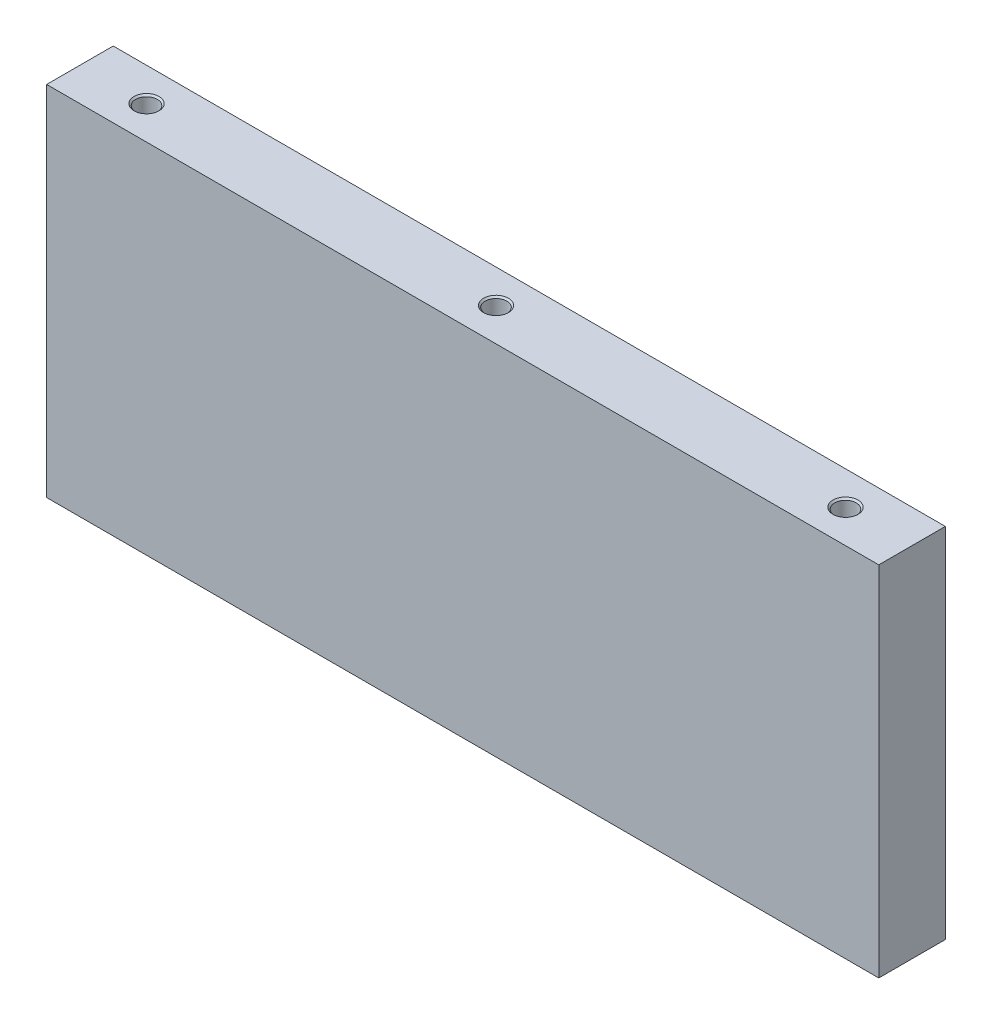
ISO-10303-21;
HEADER;
FILE_DESCRIPTION(('STEP AP214'),'2;1');
FILE_NAME('part.step','',(''),(''),'','','');
FILE_SCHEMA(('AUTOMOTIVE_DESIGN { 1 0 10303 214 1 1 1 1 }'));
ENDSEC;
DATA;
#1=APPLICATION_CONTEXT('core data for automotive mechanical design processes');
#2=APPLICATION_PROTOCOL_DEFINITION('international standard','automotive_design',2000,#1);
#3=PRODUCT_CONTEXT('',#1,'mechanical');
#4=PRODUCT('Part','Part','',(#3));
#5=PRODUCT_RELATED_PRODUCT_CATEGORY('part','',(#4));
#6=PRODUCT_DEFINITION_FORMATION('','',#4);
#7=PRODUCT_DEFINITION_CONTEXT('part definition',#1,'design');
#8=PRODUCT_DEFINITION('design','',#6,#7);
#9=PRODUCT_DEFINITION_SHAPE('','',#8);
#10=(LENGTH_UNIT() NAMED_UNIT(*) SI_UNIT(.MILLI.,.METRE.));
#11=(NAMED_UNIT(*) PLANE_ANGLE_UNIT() SI_UNIT($,.RADIAN.));
#12=(NAMED_UNIT(*) SI_UNIT($,.STERADIAN.) SOLID_ANGLE_UNIT());
#13=UNCERTAINTY_MEASURE_WITH_UNIT(LENGTH_MEASURE(1.E-05),#10,'distance_accuracy_value','');
#14=(GEOMETRIC_REPRESENTATION_CONTEXT(3) GLOBAL_UNCERTAINTY_ASSIGNED_CONTEXT((#13)) GLOBAL_UNIT_ASSIGNED_CONTEXT((#10,
#11,#12)) REPRESENTATION_CONTEXT('',''));
#15=CARTESIAN_POINT('',(0.,0.,0.));
#16=DIRECTION('',(0.,0.,1.));
#17=DIRECTION('',(1.,0.,0.));
#18=AXIS2_PLACEMENT_3D('',#15,#16,#17);
#19=CARTESIAN_POINT('',(42.,13.5,4.));
#20=DIRECTION('',(0.,1.,0.));
#21=DIRECTION('',(0.,0.,1.));
#22=AXIS2_PLACEMENT_3D('',#19,#20,#21);
#23=PLANE('',#22);
#24=CARTESIAN_POINT('',(42.,13.5,4.));
#25=DIRECTION('',(0.,1.,0.));
#26=DIRECTION('',(0.,0.,1.));
#27=AXIS2_PLACEMENT_3D('',#24,#25,#26);
#28=CIRCLE('',#27,1.3);
#29=CARTESIAN_POINT('',(42.,13.5,5.3));
#30=VERTEX_POINT('',#29);
#31=EDGE_CURVE('E117',#30,#30,#28,.T.);
#32=ORIENTED_EDGE('',*,*,#31,.T.);
#33=EDGE_LOOP('',(#32));
#34=FACE_BOUND('',#33,.T.);
#35=ADVANCED_FACE('F38',(#34),#23,.T.);
#36=CARTESIAN_POINT('',(42.,13.5,4.));
#37=DIRECTION('',(0.,1.,0.));
#38=DIRECTION('',(0.,0.,1.));
#39=AXIS2_PLACEMENT_3D('',#36,#37,#38);
#40=CYLINDRICAL_SURFACE('',#39,1.3);
#41=CARTESIAN_POINT('',(42.,21.3,4.));
#42=DIRECTION('',(0.,-1.,0.));
#43=DIRECTION('',(0.,0.,-1.));
#44=AXIS2_PLACEMENT_3D('',#41,#42,#43);
#45=CIRCLE('',#44,1.3);
#46=CARTESIAN_POINT('',(42.,21.3,2.7));
#47=VERTEX_POINT('',#46);
#48=EDGE_CURVE('E11',#47,#47,#45,.F.);
#49=ORIENTED_EDGE('',*,*,#48,.T.);
#50=EDGE_LOOP('',(#49));
#51=FACE_BOUND('',#50,.T.);
#52=ORIENTED_EDGE('',*,*,#31,.F.);
#53=EDGE_LOOP('',(#52));
#54=FACE_BOUND('',#53,.T.);
#55=ADVANCED_FACE('F170',(#51,#54),#40,.F.);
#56=CARTESIAN_POINT('',(50.,21.5,8.));
#57=DIRECTION('',(-1.,0.,0.));
#58=DIRECTION('',(0.,-1.,0.));
#59=AXIS2_PLACEMENT_3D('',#56,#57,#58);
#60=PLANE('',#59);
#61=DIRECTION('',(0.,1.,0.));
#62=VECTOR('',#61,1.);
#63=CARTESIAN_POINT('',(50.,21.5,0.));
#64=LINE('',#63,#62);
#65=CARTESIAN_POINT('',(50.,-21.5,0.));
#66=VERTEX_POINT('',#65);
#67=CARTESIAN_POINT('',(50.,21.5,0.));
#68=VERTEX_POINT('',#67);
#69=EDGE_CURVE('E107',#66,#68,#64,.T.);
#70=ORIENTED_EDGE('',*,*,#69,.T.);
#71=DIRECTION('',(0.,0.,-1.));
#72=VECTOR('',#71,1.);
#73=CARTESIAN_POINT('',(50.,21.5,8.));
#74=LINE('',#73,#72);
#75=CARTESIAN_POINT('',(50.,21.5,8.));
#76=VERTEX_POINT('',#75);
#77=EDGE_CURVE('E98',#76,#68,#74,.T.);
#78=ORIENTED_EDGE('',*,*,#77,.F.);
#79=DIRECTION('',(0.,1.,0.));
#80=VECTOR('',#79,1.);
#81=CARTESIAN_POINT('',(50.,21.5,8.));
#82=LINE('',#81,#80);
#83=CARTESIAN_POINT('',(50.,-21.5,8.));
#84=VERTEX_POINT('',#83);
#85=EDGE_CURVE('E92',#84,#76,#82,.T.);
#86=ORIENTED_EDGE('',*,*,#85,.F.);
#87=DIRECTION('',(0.,0.,-1.));
#88=VECTOR('',#87,1.);
#89=CARTESIAN_POINT('',(50.,-21.5,8.));
#90=LINE('',#89,#88);
#91=EDGE_CURVE('E103',#84,#66,#90,.T.);
#92=ORIENTED_EDGE('',*,*,#91,.T.);
#93=EDGE_LOOP('',(#70,#78,#86,#92));
#94=FACE_BOUND('',#93,.T.);
#95=ADVANCED_FACE('F176',(#94),#60,.F.);
#96=CARTESIAN_POINT('',(-50.,21.5,8.));
#97=DIRECTION('',(0.,-1.,0.));
#98=DIRECTION('',(0.,0.,-1.));
#99=AXIS2_PLACEMENT_3D('',#96,#97,#98);
#100=PLANE('',#99);
#101=CARTESIAN_POINT('',(-42.,21.5,4.));
#102=DIRECTION('',(0.,-1.,0.));
#103=DIRECTION('',(0.,0.,-1.));
#104=AXIS2_PLACEMENT_3D('',#101,#102,#103);
#105=CIRCLE('',#104,1.49999999999999);
#106=CARTESIAN_POINT('',(-42.,21.5,2.50000000000001));
#107=VERTEX_POINT('',#106);
#108=EDGE_CURVE('E147',#107,#107,#105,.T.);
#109=ORIENTED_EDGE('',*,*,#108,.T.);
#110=EDGE_LOOP('',(#109));
#111=FACE_BOUND('',#110,.T.);
#112=CARTESIAN_POINT('',(0.,21.5,4.));
#113=DIRECTION('',(0.,-1.,0.));
#114=DIRECTION('',(0.,0.,-1.));
#115=AXIS2_PLACEMENT_3D('',#112,#113,#114);
#116=CIRCLE('',#115,1.49999999999999);
#117=CARTESIAN_POINT('',(0.,21.5,2.50000000000001));
#118=VERTEX_POINT('',#117);
#119=EDGE_CURVE('E144',#118,#118,#116,.T.);
#120=ORIENTED_EDGE('',*,*,#119,.T.);
#121=EDGE_LOOP('',(#120));
#122=FACE_BOUND('',#121,.T.);
#123=CARTESIAN_POINT('',(42.,21.5,4.));
#124=DIRECTION('',(0.,-1.,0.));
#125=DIRECTION('',(0.,0.,-1.));
#126=AXIS2_PLACEMENT_3D('',#123,#124,#125);
#127=CIRCLE('',#126,1.49999999999999);
#128=CARTESIAN_POINT('',(42.,21.5,2.50000000000001));
#129=VERTEX_POINT('',#128);
#130=EDGE_CURVE('E141',#129,#129,#127,.T.);
#131=ORIENTED_EDGE('',*,*,#130,.T.);
#132=EDGE_LOOP('',(#131));
#133=FACE_BOUND('',#132,.T.);
#134=DIRECTION('',(-1.,0.,0.));
#135=VECTOR('',#134,1.);
#136=CARTESIAN_POINT('',(-50.,21.5,0.));
#137=LINE('',#136,#135);
#138=CARTESIAN_POINT('',(-50.,21.5,0.));
#139=VERTEX_POINT('',#138);
#140=EDGE_CURVE('E97',#68,#139,#137,.T.);
#141=ORIENTED_EDGE('',*,*,#140,.T.);
#142=DIRECTION('',(0.,0.,-1.));
#143=VECTOR('',#142,1.);
#144=CARTESIAN_POINT('',(-50.,21.5,8.));
#145=LINE('',#144,#143);
#146=CARTESIAN_POINT('',(-50.,21.5,8.));
#147=VERTEX_POINT('',#146);
#148=EDGE_CURVE('E95',#147,#139,#145,.T.);
#149=ORIENTED_EDGE('',*,*,#148,.F.);
#150=DIRECTION('',(-1.,0.,0.));
#151=VECTOR('',#150,1.);
#152=CARTESIAN_POINT('',(-50.,21.5,8.));
#153=LINE('',#152,#151);
#154=EDGE_CURVE('E87',#76,#147,#153,.T.);
#155=ORIENTED_EDGE('',*,*,#154,.F.);
#156=ORIENTED_EDGE('',*,*,#77,.T.);
#157=EDGE_LOOP('',(#141,#149,#155,#156));
#158=FACE_BOUND('',#157,.T.);
#159=ADVANCED_FACE('F96',(#111,#122,#133,#158),#100,.F.);
#160=CARTESIAN_POINT('',(-50.,21.5,8.));
#161=DIRECTION('',(1.,0.,0.));
#162=DIRECTION('',(0.,1.,0.));
#163=AXIS2_PLACEMENT_3D('',#160,#161,#162);
#164=PLANE('',#163);
#165=DIRECTION('',(0.,-1.,0.));
#166=VECTOR('',#165,1.);
#167=CARTESIAN_POINT('',(-50.,21.5,0.));
#168=LINE('',#167,#166);
#169=CARTESIAN_POINT('',(-50.,-21.5,0.));
#170=VERTEX_POINT('',#169);
#171=EDGE_CURVE('E73',#139,#170,#168,.T.);
#172=ORIENTED_EDGE('',*,*,#171,.T.);
#173=DIRECTION('',(0.,0.,-1.));
#174=VECTOR('',#173,1.);
#175=CARTESIAN_POINT('',(-50.,-21.5,8.));
#176=LINE('',#175,#174);
#177=CARTESIAN_POINT('',(-50.,-21.5,8.));
#178=VERTEX_POINT('',#177);
#179=EDGE_CURVE('E99',#178,#170,#176,.T.);
#180=ORIENTED_EDGE('',*,*,#179,.F.);
#181=DIRECTION('',(0.,-1.,0.));
#182=VECTOR('',#181,1.);
#183=CARTESIAN_POINT('',(-50.,21.5,8.));
#184=LINE('',#183,#182);
#185=EDGE_CURVE('E90',#147,#178,#184,.T.);
#186=ORIENTED_EDGE('',*,*,#185,.F.);
#187=ORIENTED_EDGE('',*,*,#148,.T.);
#188=EDGE_LOOP('',(#172,#180,#186,#187));
#189=FACE_BOUND('',#188,.T.);
#190=ADVANCED_FACE('F101',(#189),#164,.F.);
#191=CARTESIAN_POINT('',(-50.,-21.5,8.));
#192=DIRECTION('',(0.,1.,0.));
#193=DIRECTION('',(0.,0.,1.));
#194=AXIS2_PLACEMENT_3D('',#191,#192,#193);
#195=PLANE('',#194);
#196=CARTESIAN_POINT('',(42.,-21.5,4.));
#197=DIRECTION('',(0.,1.,0.));
#198=DIRECTION('',(0.,0.,1.));
#199=AXIS2_PLACEMENT_3D('',#196,#197,#198);
#200=CIRCLE('',#199,1.50000000000002);
#201=CARTESIAN_POINT('',(42.,-21.5,2.49999999999998));
#202=VERTEX_POINT('',#201);
#203=EDGE_CURVE('E126',#202,#202,#200,.T.);
#204=ORIENTED_EDGE('',*,*,#203,.T.);
#205=EDGE_LOOP('',(#204));
#206=FACE_BOUND('',#205,.T.);
#207=CARTESIAN_POINT('',(0.,-21.5,4.));
#208=DIRECTION('',(0.,1.,0.));
#209=DIRECTION('',(0.,0.,1.));
#210=AXIS2_PLACEMENT_3D('',#207,#208,#209);
#211=CIRCLE('',#210,1.50000000000002);
#212=CARTESIAN_POINT('',(0.,-21.5,2.49999999999998));
#213=VERTEX_POINT('',#212);
#214=EDGE_CURVE('E123',#213,#213,#211,.T.);
#215=ORIENTED_EDGE('',*,*,#214,.T.);
#216=EDGE_LOOP('',(#215));
#217=FACE_BOUND('',#216,.T.);
#218=CARTESIAN_POINT('',(-42.,-21.5,4.));
#219=DIRECTION('',(0.,1.,0.));
#220=DIRECTION('',(0.,0.,1.));
#221=AXIS2_PLACEMENT_3D('',#218,#219,#220);
#222=CIRCLE('',#221,1.50000000000002);
#223=CARTESIAN_POINT('',(-42.,-21.5,2.49999999999998));
#224=VERTEX_POINT('',#223);
#225=EDGE_CURVE('E120',#224,#224,#222,.T.);
#226=ORIENTED_EDGE('',*,*,#225,.T.);
#227=EDGE_LOOP('',(#226));
#228=FACE_BOUND('',#227,.T.);
#229=DIRECTION('',(1.,0.,0.));
#230=VECTOR('',#229,1.);
#231=CARTESIAN_POINT('',(-50.,-21.5,0.));
#232=LINE('',#231,#230);
#233=EDGE_CURVE('E79',#170,#66,#232,.T.);
#234=ORIENTED_EDGE('',*,*,#233,.T.);
#235=ORIENTED_EDGE('',*,*,#91,.F.);
#236=DIRECTION('',(1.,0.,0.));
#237=VECTOR('',#236,1.);
#238=CARTESIAN_POINT('',(-50.,-21.5,8.));
#239=LINE('',#238,#237);
#240=EDGE_CURVE('E56',#178,#84,#239,.T.);
#241=ORIENTED_EDGE('',*,*,#240,.F.);
#242=ORIENTED_EDGE('',*,*,#179,.T.);
#243=EDGE_LOOP('',(#234,#235,#241,#242));
#244=FACE_BOUND('',#243,.T.);
#245=ADVANCED_FACE('F214',(#206,#217,#228,#244),#195,.F.);
#246=CARTESIAN_POINT('',(0.,0.,8.));
#247=DIRECTION('',(0.,0.,1.));
#248=DIRECTION('',(1.,0.,0.));
#249=AXIS2_PLACEMENT_3D('',#246,#247,#248);
#250=PLANE('',#249);
#251=ORIENTED_EDGE('',*,*,#85,.T.);
#252=ORIENTED_EDGE('',*,*,#154,.T.);
#253=ORIENTED_EDGE('',*,*,#185,.T.);
#254=ORIENTED_EDGE('',*,*,#240,.T.);
#255=EDGE_LOOP('',(#251,#252,#253,#254));
#256=FACE_BOUND('',#255,.T.);
#257=ADVANCED_FACE('F88',(#256),#250,.T.);
#258=CARTESIAN_POINT('',(0.,0.,0.));
#259=DIRECTION('',(0.,0.,1.));
#260=DIRECTION('',(1.,0.,0.));
#261=AXIS2_PLACEMENT_3D('',#258,#259,#260);
#262=PLANE('',#261);
#263=ORIENTED_EDGE('',*,*,#69,.F.);
#264=ORIENTED_EDGE('',*,*,#233,.F.);
#265=ORIENTED_EDGE('',*,*,#171,.F.);
#266=ORIENTED_EDGE('',*,*,#140,.F.);
#267=EDGE_LOOP('',(#263,#264,#265,#266));
#268=FACE_BOUND('',#267,.T.);
#269=ADVANCED_FACE('F222',(#268),#262,.F.);
#270=CARTESIAN_POINT('',(-42.,13.5,4.));
#271=DIRECTION('',(0.,1.,0.));
#272=DIRECTION('',(0.,0.,1.));
#273=AXIS2_PLACEMENT_3D('',#270,#271,#272);
#274=CYLINDRICAL_SURFACE('',#273,1.3);
#275=CARTESIAN_POINT('',(-42.,21.3,4.));
#276=DIRECTION('',(0.,-1.,0.));
#277=DIRECTION('',(0.,0.,-1.));
#278=AXIS2_PLACEMENT_3D('',#275,#276,#277);
#279=CIRCLE('',#278,1.3);
#280=CARTESIAN_POINT('',(-42.,21.3,2.7));
#281=VERTEX_POINT('',#280);
#282=EDGE_CURVE('E138',#281,#281,#279,.F.);
#283=ORIENTED_EDGE('',*,*,#282,.T.);
#284=EDGE_LOOP('',(#283));
#285=FACE_BOUND('',#284,.T.);
#286=CARTESIAN_POINT('',(-42.,13.5,4.));
#287=DIRECTION('',(0.,1.,0.));
#288=DIRECTION('',(0.,0.,1.));
#289=AXIS2_PLACEMENT_3D('',#286,#287,#288);
#290=CIRCLE('',#289,1.3);
#291=CARTESIAN_POINT('',(-42.,13.5,5.3));
#292=VERTEX_POINT('',#291);
#293=EDGE_CURVE('E110',#292,#292,#290,.T.);
#294=ORIENTED_EDGE('',*,*,#293,.F.);
#295=EDGE_LOOP('',(#294));
#296=FACE_BOUND('',#295,.T.);
#297=ADVANCED_FACE('F237',(#285,#296),#274,.F.);
#298=CARTESIAN_POINT('',(-42.,13.5,4.));
#299=DIRECTION('',(0.,1.,0.));
#300=DIRECTION('',(0.,0.,1.));
#301=AXIS2_PLACEMENT_3D('',#298,#299,#300);
#302=PLANE('',#301);
#303=ORIENTED_EDGE('',*,*,#293,.T.);
#304=EDGE_LOOP('',(#303));
#305=FACE_BOUND('',#304,.T.);
#306=ADVANCED_FACE('F241',(#305),#302,.T.);
#307=CARTESIAN_POINT('',(0.,13.5,4.));
#308=DIRECTION('',(0.,1.,0.));
#309=DIRECTION('',(0.,0.,1.));
#310=AXIS2_PLACEMENT_3D('',#307,#308,#309);
#311=CYLINDRICAL_SURFACE('',#310,1.3);
#312=CARTESIAN_POINT('',(0.,21.3,4.));
#313=DIRECTION('',(0.,-1.,0.));
#314=DIRECTION('',(0.,0.,-1.));
#315=AXIS2_PLACEMENT_3D('',#312,#313,#314);
#316=CIRCLE('',#315,1.3);
#317=CARTESIAN_POINT('',(0.,21.3,2.7));
#318=VERTEX_POINT('',#317);
#319=EDGE_CURVE('E48',#318,#318,#316,.F.);
#320=ORIENTED_EDGE('',*,*,#319,.T.);
#321=EDGE_LOOP('',(#320));
#322=FACE_BOUND('',#321,.T.);
#323=CARTESIAN_POINT('',(0.,13.5,4.));
#324=DIRECTION('',(0.,1.,0.));
#325=DIRECTION('',(0.,0.,1.));
#326=AXIS2_PLACEMENT_3D('',#323,#324,#325);
#327=CIRCLE('',#326,1.3);
#328=CARTESIAN_POINT('',(0.,13.5,5.3));
#329=VERTEX_POINT('',#328);
#330=EDGE_CURVE('E289',#329,#329,#327,.T.);
#331=ORIENTED_EDGE('',*,*,#330,.F.);
#332=EDGE_LOOP('',(#331));
#333=FACE_BOUND('',#332,.T.);
#334=ADVANCED_FACE('F152',(#322,#333),#311,.F.);
#335=CARTESIAN_POINT('',(0.,13.5,4.));
#336=DIRECTION('',(0.,1.,0.));
#337=DIRECTION('',(0.,0.,1.));
#338=AXIS2_PLACEMENT_3D('',#335,#336,#337);
#339=PLANE('',#338);
#340=ORIENTED_EDGE('',*,*,#330,.T.);
#341=EDGE_LOOP('',(#340));
#342=FACE_BOUND('',#341,.T.);
#343=ADVANCED_FACE('F253',(#342),#339,.T.);
#344=CARTESIAN_POINT('',(-42.,-13.5,4.));
#345=DIRECTION('',(0.,-1.,0.));
#346=DIRECTION('',(0.,0.,-1.));
#347=AXIS2_PLACEMENT_3D('',#344,#345,#346);
#348=CYLINDRICAL_SURFACE('',#347,1.3);
#349=CARTESIAN_POINT('',(-42.,-21.3,4.));
#350=DIRECTION('',(0.,1.,0.));
#351=DIRECTION('',(0.,0.,1.));
#352=AXIS2_PLACEMENT_3D('',#349,#350,#351);
#353=CIRCLE('',#352,1.3);
#354=CARTESIAN_POINT('',(-42.,-21.3,2.7));
#355=VERTEX_POINT('',#354);
#356=EDGE_CURVE('E135',#355,#355,#353,.F.);
#357=ORIENTED_EDGE('',*,*,#356,.T.);
#358=EDGE_LOOP('',(#357));
#359=FACE_BOUND('',#358,.T.);
#360=CARTESIAN_POINT('',(-42.,-13.5,4.));
#361=DIRECTION('',(0.,1.,0.));
#362=DIRECTION('',(0.,0.,1.));
#363=AXIS2_PLACEMENT_3D('',#360,#361,#362);
#364=CIRCLE('',#363,1.3);
#365=CARTESIAN_POINT('',(-42.,-13.5,5.3));
#366=VERTEX_POINT('',#365);
#367=EDGE_CURVE('E285',#366,#366,#364,.T.);
#368=ORIENTED_EDGE('',*,*,#367,.T.);
#369=EDGE_LOOP('',(#368));
#370=FACE_BOUND('',#369,.T.);
#371=ADVANCED_FACE('F256',(#359,#370),#348,.F.);
#372=CARTESIAN_POINT('',(-42.,-13.5,4.));
#373=DIRECTION('',(0.,-1.,0.));
#374=DIRECTION('',(0.,0.,1.));
#375=AXIS2_PLACEMENT_3D('',#372,#373,#374);
#376=PLANE('',#375);
#377=ORIENTED_EDGE('',*,*,#367,.F.);
#378=EDGE_LOOP('',(#377));
#379=FACE_BOUND('',#378,.T.);
#380=ADVANCED_FACE('F260',(#379),#376,.T.);
#381=CARTESIAN_POINT('',(42.,-13.5,4.));
#382=DIRECTION('',(0.,-1.,0.));
#383=DIRECTION('',(0.,0.,-1.));
#384=AXIS2_PLACEMENT_3D('',#381,#382,#383);
#385=CYLINDRICAL_SURFACE('',#384,1.3);
#386=CARTESIAN_POINT('',(42.,-21.3,4.));
#387=DIRECTION('',(0.,1.,0.));
#388=DIRECTION('',(0.,0.,1.));
#389=AXIS2_PLACEMENT_3D('',#386,#387,#388);
#390=CIRCLE('',#389,1.3);
#391=CARTESIAN_POINT('',(42.,-21.3,2.7));
#392=VERTEX_POINT('',#391);
#393=EDGE_CURVE('E129',#392,#392,#390,.F.);
#394=ORIENTED_EDGE('',*,*,#393,.T.);
#395=EDGE_LOOP('',(#394));
#396=FACE_BOUND('',#395,.T.);
#397=CARTESIAN_POINT('',(42.,-13.5,4.));
#398=DIRECTION('',(0.,1.,0.));
#399=DIRECTION('',(0.,0.,1.));
#400=AXIS2_PLACEMENT_3D('',#397,#398,#399);
#401=CIRCLE('',#400,1.3);
#402=CARTESIAN_POINT('',(42.,-13.5,5.3));
#403=VERTEX_POINT('',#402);
#404=EDGE_CURVE('E286',#403,#403,#401,.T.);
#405=ORIENTED_EDGE('',*,*,#404,.T.);
#406=EDGE_LOOP('',(#405));
#407=FACE_BOUND('',#406,.T.);
#408=ADVANCED_FACE('F264',(#396,#407),#385,.F.);
#409=CARTESIAN_POINT('',(42.,-13.5,4.));
#410=DIRECTION('',(0.,-1.,0.));
#411=DIRECTION('',(0.,0.,1.));
#412=AXIS2_PLACEMENT_3D('',#409,#410,#411);
#413=PLANE('',#412);
#414=ORIENTED_EDGE('',*,*,#404,.F.);
#415=EDGE_LOOP('',(#414));
#416=FACE_BOUND('',#415,.T.);
#417=ADVANCED_FACE('F268',(#416),#413,.T.);
#418=CARTESIAN_POINT('',(0.,-13.5,4.));
#419=DIRECTION('',(0.,-1.,0.));
#420=DIRECTION('',(0.,0.,-1.));
#421=AXIS2_PLACEMENT_3D('',#418,#419,#420);
#422=CYLINDRICAL_SURFACE('',#421,1.3);
#423=CARTESIAN_POINT('',(0.,-21.3,4.));
#424=DIRECTION('',(0.,1.,0.));
#425=DIRECTION('',(0.,0.,1.));
#426=AXIS2_PLACEMENT_3D('',#423,#424,#425);
#427=CIRCLE('',#426,1.3);
#428=CARTESIAN_POINT('',(0.,-21.3,2.7));
#429=VERTEX_POINT('',#428);
#430=EDGE_CURVE('E132',#429,#429,#427,.F.);
#431=ORIENTED_EDGE('',*,*,#430,.T.);
#432=EDGE_LOOP('',(#431));
#433=FACE_BOUND('',#432,.T.);
#434=CARTESIAN_POINT('',(0.,-13.5,4.));
#435=DIRECTION('',(0.,1.,0.));
#436=DIRECTION('',(0.,0.,1.));
#437=AXIS2_PLACEMENT_3D('',#434,#435,#436);
#438=CIRCLE('',#437,1.3);
#439=CARTESIAN_POINT('',(0.,-13.5,5.3));
#440=VERTEX_POINT('',#439);
#441=EDGE_CURVE('E283',#440,#440,#438,.T.);
#442=ORIENTED_EDGE('',*,*,#441,.T.);
#443=EDGE_LOOP('',(#442));
#444=FACE_BOUND('',#443,.T.);
#445=ADVANCED_FACE('F272',(#433,#444),#422,.F.);
#446=CARTESIAN_POINT('',(0.,-13.5,4.));
#447=DIRECTION('',(0.,-1.,0.));
#448=DIRECTION('',(0.,0.,1.));
#449=AXIS2_PLACEMENT_3D('',#446,#447,#448);
#450=PLANE('',#449);
#451=ORIENTED_EDGE('',*,*,#441,.F.);
#452=EDGE_LOOP('',(#451));
#453=FACE_BOUND('',#452,.T.);
#454=ADVANCED_FACE('F189',(#453),#450,.T.);
#455=CARTESIAN_POINT('',(42.,-21.5,4.));
#456=DIRECTION('',(0.,-1.,0.));
#457=DIRECTION('',(0.,0.,-1.));
#458=AXIS2_PLACEMENT_3D('',#455,#456,#457);
#459=CONICAL_SURFACE('',#458,1.50000000000002,0.785398163397442);
#460=CARTESIAN_POINT('',(42.,-21.3,2.7));
#461=CARTESIAN_POINT('',(42.,-21.3020833333333,2.69791666666666));
#462=CARTESIAN_POINT('',(42.,-21.3041666666667,2.69583333333333));
#463=CARTESIAN_POINT('',(42.,-21.3083333333333,2.69166666666666));
#464=CARTESIAN_POINT('',(42.,-21.3104166666667,2.68958333333333));
#465=CARTESIAN_POINT('',(42.,-21.3145833333333,2.68541666666666));
#466=CARTESIAN_POINT('',(42.,-21.3166666666667,2.68333333333333));
#467=CARTESIAN_POINT('',(42.,-21.3208333333333,2.67916666666666));
#468=CARTESIAN_POINT('',(42.,-21.3229166666667,2.67708333333333));
#469=CARTESIAN_POINT('',(42.,-21.3270833333333,2.67291666666666));
#470=CARTESIAN_POINT('',(42.,-21.3291666666667,2.67083333333333));
#471=CARTESIAN_POINT('',(42.,-21.3333333333333,2.66666666666666));
#472=CARTESIAN_POINT('',(42.,-21.3354166666667,2.66458333333333));
#473=CARTESIAN_POINT('',(42.,-21.3395833333333,2.66041666666666));
#474=CARTESIAN_POINT('',(42.,-21.3416666666667,2.65833333333333));
#475=CARTESIAN_POINT('',(42.,-21.3458333333333,2.65416666666666));
#476=CARTESIAN_POINT('',(42.,-21.3479166666667,2.65208333333333));
#477=CARTESIAN_POINT('',(42.,-21.3520833333333,2.64791666666666));
#478=CARTESIAN_POINT('',(42.,-21.3541666666667,2.64583333333333));
#479=CARTESIAN_POINT('',(42.,-21.3583333333333,2.64166666666666));
#480=CARTESIAN_POINT('',(42.,-21.3604166666667,2.63958333333333));
#481=CARTESIAN_POINT('',(42.,-21.3645833333333,2.63541666666666));
#482=CARTESIAN_POINT('',(42.,-21.3666666666667,2.63333333333333));
#483=CARTESIAN_POINT('',(42.,-21.3708333333333,2.62916666666666));
#484=CARTESIAN_POINT('',(42.,-21.3729166666667,2.62708333333333));
#485=CARTESIAN_POINT('',(42.,-21.3770833333333,2.62291666666666));
#486=CARTESIAN_POINT('',(42.,-21.3791666666667,2.62083333333332));
#487=CARTESIAN_POINT('',(42.,-21.3833333333333,2.61666666666666));
#488=CARTESIAN_POINT('',(42.,-21.3854166666667,2.61458333333332));
#489=CARTESIAN_POINT('',(42.,-21.3895833333333,2.61041666666666));
#490=CARTESIAN_POINT('',(42.,-21.3916666666667,2.60833333333332));
#491=CARTESIAN_POINT('',(42.,-21.3958333333333,2.60416666666666));
#492=CARTESIAN_POINT('',(42.,-21.3979166666667,2.60208333333332));
#493=CARTESIAN_POINT('',(42.,-21.4020833333333,2.59791666666666));
#494=CARTESIAN_POINT('',(42.,-21.4041666666667,2.59583333333332));
#495=CARTESIAN_POINT('',(42.,-21.4083333333333,2.59166666666666));
#496=CARTESIAN_POINT('',(42.,-21.4104166666667,2.58958333333332));
#497=CARTESIAN_POINT('',(42.,-21.4145833333333,2.58541666666666));
#498=CARTESIAN_POINT('',(42.,-21.4166666666667,2.58333333333332));
#499=CARTESIAN_POINT('',(42.,-21.4208333333333,2.57916666666666));
#500=CARTESIAN_POINT('',(42.,-21.4229166666667,2.57708333333332));
#501=CARTESIAN_POINT('',(42.,-21.4270833333333,2.57291666666665));
#502=CARTESIAN_POINT('',(42.,-21.4291666666667,2.57083333333332));
#503=CARTESIAN_POINT('',(42.,-21.4333333333333,2.56666666666665));
#504=CARTESIAN_POINT('',(42.,-21.4354166666667,2.56458333333332));
#505=CARTESIAN_POINT('',(42.,-21.4395833333333,2.56041666666665));
#506=CARTESIAN_POINT('',(42.,-21.4416666666667,2.55833333333332));
#507=CARTESIAN_POINT('',(42.,-21.4458333333333,2.55416666666665));
#508=CARTESIAN_POINT('',(42.,-21.4479166666667,2.55208333333332));
#509=CARTESIAN_POINT('',(42.,-21.4520833333333,2.54791666666665));
#510=CARTESIAN_POINT('',(42.,-21.4541666666667,2.54583333333332));
#511=CARTESIAN_POINT('',(42.,-21.4583333333333,2.54166666666665));
#512=CARTESIAN_POINT('',(42.,-21.4604166666667,2.53958333333332));
#513=CARTESIAN_POINT('',(42.,-21.4645833333333,2.53541666666665));
#514=CARTESIAN_POINT('',(42.,-21.4666666666667,2.53333333333332));
#515=CARTESIAN_POINT('',(42.,-21.4708333333333,2.52916666666665));
#516=CARTESIAN_POINT('',(42.,-21.4729166666667,2.52708333333332));
#517=CARTESIAN_POINT('',(42.,-21.4770833333333,2.52291666666665));
#518=CARTESIAN_POINT('',(42.,-21.4791666666667,2.52083333333332));
#519=CARTESIAN_POINT('',(42.,-21.4833333333333,2.51666666666665));
#520=CARTESIAN_POINT('',(42.,-21.4854166666667,2.51458333333332));
#521=CARTESIAN_POINT('',(42.,-21.4895833333333,2.51041666666665));
#522=CARTESIAN_POINT('',(42.,-21.4916666666667,2.50833333333332));
#523=CARTESIAN_POINT('',(42.,-21.4958333333333,2.50416666666665));
#524=CARTESIAN_POINT('',(42.,-21.4979166666667,2.50208333333332));
#525=CARTESIAN_POINT('',(42.,-21.5,2.49999999999998));
#526=B_SPLINE_CURVE_WITH_KNOTS('',3,(#460,#461,#462,#463,#464,#465,#466,#467,#468,#469,#470,
#471,#472,#473,#474,#475,#476,#477,#478,#479,#480,#481,#482,#483,#484,#485,#486,#487,#488,#489,
#490,#491,#492,#493,#494,#495,#496,#497,#498,#499,#500,#501,#502,#503,#504,#505,#506,#507,#508,
#509,#510,#511,#512,#513,#514,#515,#516,#517,#518,#519,#520,#521,#522,#523,#524,#525),
.UNSPECIFIED.,.F.,.F.,(4,2,2,2,2,2,2,2,2,2,2,2,2,2,2,2,2,2,2,2,2,2,2,2,2,2,2,2,2,2,2,2,4),(0.,
0.00883883476483394,0.0176776695296657,0.0265165042945,0.0353553390593314,0.0441941738241629,
0.0530330085889972,0.061871843353829,0.0707106781186605,0.0795495128834947,0.0883883476483265,
0.097227182413158,0.106066017177992,0.114904851942824,0.123743686707655,0.132582521472489,
0.141421356237321,0.150260191002153,0.159099025766987,0.167937860531818,0.17677669529665,
0.185615530061485,0.194454364826316,0.203293199591148,0.212132034355982,0.220970869120814,
0.229809703885645,0.238648538650479,0.247487373415311,0.256326208180142,0.265165042944977,
0.274003877709808,0.28284271247464),.UNSPECIFIED.);
#527=EDGE_CURVE('BSEAM182',#392,#202,#526,.T.);
#528=ORIENTED_EDGE('',*,*,#393,.F.);
#529=ORIENTED_EDGE('',*,*,#203,.F.);
#530=ORIENTED_EDGE('',*,*,#527,.T.);
#531=ORIENTED_EDGE('',*,*,#527,.F.);
#532=EDGE_LOOP('',(#528,#530,#529,#531));
#533=FACE_BOUND('',#532,.T.);
#534=ADVANCED_FACE('F182',(#533),#459,.F.);
#535=CARTESIAN_POINT('',(0.,-21.5,4.));
#536=DIRECTION('',(0.,-1.,0.));
#537=DIRECTION('',(0.,0.,-1.));
#538=AXIS2_PLACEMENT_3D('',#535,#536,#537);
#539=CONICAL_SURFACE('',#538,1.50000000000002,0.785398163397442);
#540=CARTESIAN_POINT('',(0.,-21.3,2.7));
#541=CARTESIAN_POINT('',(0.,-21.3020833333333,2.69791666666666));
#542=CARTESIAN_POINT('',(0.,-21.3041666666667,2.69583333333333));
#543=CARTESIAN_POINT('',(0.,-21.3083333333333,2.69166666666666));
#544=CARTESIAN_POINT('',(0.,-21.3104166666667,2.68958333333333));
#545=CARTESIAN_POINT('',(0.,-21.3145833333333,2.68541666666666));
#546=CARTESIAN_POINT('',(0.,-21.3166666666667,2.68333333333333));
#547=CARTESIAN_POINT('',(0.,-21.3208333333333,2.67916666666666));
#548=CARTESIAN_POINT('',(0.,-21.3229166666667,2.67708333333333));
#549=CARTESIAN_POINT('',(0.,-21.3270833333333,2.67291666666666));
#550=CARTESIAN_POINT('',(0.,-21.3291666666667,2.67083333333333));
#551=CARTESIAN_POINT('',(0.,-21.3333333333333,2.66666666666666));
#552=CARTESIAN_POINT('',(0.,-21.3354166666667,2.66458333333333));
#553=CARTESIAN_POINT('',(0.,-21.3395833333333,2.66041666666666));
#554=CARTESIAN_POINT('',(0.,-21.3416666666667,2.65833333333333));
#555=CARTESIAN_POINT('',(0.,-21.3458333333333,2.65416666666666));
#556=CARTESIAN_POINT('',(0.,-21.3479166666667,2.65208333333333));
#557=CARTESIAN_POINT('',(0.,-21.3520833333333,2.64791666666666));
#558=CARTESIAN_POINT('',(0.,-21.3541666666667,2.64583333333333));
#559=CARTESIAN_POINT('',(0.,-21.3583333333333,2.64166666666666));
#560=CARTESIAN_POINT('',(0.,-21.3604166666667,2.63958333333333));
#561=CARTESIAN_POINT('',(0.,-21.3645833333333,2.63541666666666));
#562=CARTESIAN_POINT('',(0.,-21.3666666666667,2.63333333333333));
#563=CARTESIAN_POINT('',(0.,-21.3708333333333,2.62916666666666));
#564=CARTESIAN_POINT('',(0.,-21.3729166666667,2.62708333333333));
#565=CARTESIAN_POINT('',(0.,-21.3770833333333,2.62291666666666));
#566=CARTESIAN_POINT('',(0.,-21.3791666666667,2.62083333333332));
#567=CARTESIAN_POINT('',(0.,-21.3833333333333,2.61666666666666));
#568=CARTESIAN_POINT('',(0.,-21.3854166666667,2.61458333333332));
#569=CARTESIAN_POINT('',(0.,-21.3895833333333,2.61041666666666));
#570=CARTESIAN_POINT('',(0.,-21.3916666666667,2.60833333333332));
#571=CARTESIAN_POINT('',(0.,-21.3958333333333,2.60416666666666));
#572=CARTESIAN_POINT('',(0.,-21.3979166666667,2.60208333333332));
#573=CARTESIAN_POINT('',(0.,-21.4020833333333,2.59791666666666));
#574=CARTESIAN_POINT('',(0.,-21.4041666666667,2.59583333333332));
#575=CARTESIAN_POINT('',(0.,-21.4083333333333,2.59166666666666));
#576=CARTESIAN_POINT('',(0.,-21.4104166666667,2.58958333333332));
#577=CARTESIAN_POINT('',(0.,-21.4145833333333,2.58541666666666));
#578=CARTESIAN_POINT('',(0.,-21.4166666666667,2.58333333333332));
#579=CARTESIAN_POINT('',(0.,-21.4208333333333,2.57916666666666));
#580=CARTESIAN_POINT('',(0.,-21.4229166666667,2.57708333333332));
#581=CARTESIAN_POINT('',(0.,-21.4270833333333,2.57291666666665));
#582=CARTESIAN_POINT('',(0.,-21.4291666666667,2.57083333333332));
#583=CARTESIAN_POINT('',(0.,-21.4333333333333,2.56666666666665));
#584=CARTESIAN_POINT('',(0.,-21.4354166666667,2.56458333333332));
#585=CARTESIAN_POINT('',(0.,-21.4395833333333,2.56041666666665));
#586=CARTESIAN_POINT('',(0.,-21.4416666666667,2.55833333333332));
#587=CARTESIAN_POINT('',(0.,-21.4458333333333,2.55416666666665));
#588=CARTESIAN_POINT('',(0.,-21.4479166666667,2.55208333333332));
#589=CARTESIAN_POINT('',(0.,-21.4520833333333,2.54791666666665));
#590=CARTESIAN_POINT('',(0.,-21.4541666666667,2.54583333333332));
#591=CARTESIAN_POINT('',(0.,-21.4583333333333,2.54166666666665));
#592=CARTESIAN_POINT('',(0.,-21.4604166666667,2.53958333333332));
#593=CARTESIAN_POINT('',(0.,-21.4645833333333,2.53541666666665));
#594=CARTESIAN_POINT('',(0.,-21.4666666666667,2.53333333333332));
#595=CARTESIAN_POINT('',(0.,-21.4708333333333,2.52916666666665));
#596=CARTESIAN_POINT('',(0.,-21.4729166666667,2.52708333333332));
#597=CARTESIAN_POINT('',(0.,-21.4770833333333,2.52291666666665));
#598=CARTESIAN_POINT('',(0.,-21.4791666666667,2.52083333333332));
#599=CARTESIAN_POINT('',(0.,-21.4833333333333,2.51666666666665));
#600=CARTESIAN_POINT('',(0.,-21.4854166666667,2.51458333333332));
#601=CARTESIAN_POINT('',(0.,-21.4895833333333,2.51041666666665));
#602=CARTESIAN_POINT('',(0.,-21.4916666666667,2.50833333333332));
#603=CARTESIAN_POINT('',(0.,-21.4958333333333,2.50416666666665));
#604=CARTESIAN_POINT('',(0.,-21.4979166666667,2.50208333333332));
#605=CARTESIAN_POINT('',(0.,-21.5,2.49999999999998));
#606=B_SPLINE_CURVE_WITH_KNOTS('',3,(#540,#541,#542,#543,#544,#545,#546,#547,#548,#549,#550,
#551,#552,#553,#554,#555,#556,#557,#558,#559,#560,#561,#562,#563,#564,#565,#566,#567,#568,#569,
#570,#571,#572,#573,#574,#575,#576,#577,#578,#579,#580,#581,#582,#583,#584,#585,#586,#587,#588,
#589,#590,#591,#592,#593,#594,#595,#596,#597,#598,#599,#600,#601,#602,#603,#604,#605),
.UNSPECIFIED.,.F.,.F.,(4,2,2,2,2,2,2,2,2,2,2,2,2,2,2,2,2,2,2,2,2,2,2,2,2,2,2,2,2,2,2,2,4),(0.,
0.00883883476483394,0.0176776695296657,0.0265165042945,0.0353553390593314,0.0441941738241629,
0.0530330085889972,0.061871843353829,0.0707106781186605,0.0795495128834947,0.0883883476483265,
0.097227182413158,0.106066017177992,0.114904851942824,0.123743686707655,0.132582521472489,
0.141421356237321,0.150260191002153,0.159099025766987,0.167937860531818,0.17677669529665,
0.185615530061485,0.194454364826316,0.203293199591148,0.212132034355982,0.220970869120814,
0.229809703885645,0.238648538650479,0.247487373415311,0.256326208180142,0.265165042944977,
0.274003877709808,0.28284271247464),.UNSPECIFIED.);
#607=EDGE_CURVE('BSEAM188',#429,#213,#606,.T.);
#608=ORIENTED_EDGE('',*,*,#430,.F.);
#609=ORIENTED_EDGE('',*,*,#214,.F.);
#610=ORIENTED_EDGE('',*,*,#607,.T.);
#611=ORIENTED_EDGE('',*,*,#607,.F.);
#612=EDGE_LOOP('',(#608,#610,#609,#611));
#613=FACE_BOUND('',#612,.T.);
#614=ADVANCED_FACE('F188',(#613),#539,.F.);
#615=CARTESIAN_POINT('',(-42.,-21.5,4.));
#616=DIRECTION('',(0.,-1.,0.));
#617=DIRECTION('',(0.,0.,-1.));
#618=AXIS2_PLACEMENT_3D('',#615,#616,#617);
#619=CONICAL_SURFACE('',#618,1.50000000000002,0.785398163397442);
#620=CARTESIAN_POINT('',(-42.,-21.3,2.7));
#621=CARTESIAN_POINT('',(-42.,-21.3020833333333,2.69791666666666));
#622=CARTESIAN_POINT('',(-42.,-21.3041666666667,2.69583333333333));
#623=CARTESIAN_POINT('',(-42.,-21.3083333333333,2.69166666666666));
#624=CARTESIAN_POINT('',(-42.,-21.3104166666667,2.68958333333333));
#625=CARTESIAN_POINT('',(-42.,-21.3145833333333,2.68541666666666));
#626=CARTESIAN_POINT('',(-42.,-21.3166666666667,2.68333333333333));
#627=CARTESIAN_POINT('',(-42.,-21.3208333333333,2.67916666666666));
#628=CARTESIAN_POINT('',(-42.,-21.3229166666667,2.67708333333333));
#629=CARTESIAN_POINT('',(-42.,-21.3270833333333,2.67291666666666));
#630=CARTESIAN_POINT('',(-42.,-21.3291666666667,2.67083333333333));
#631=CARTESIAN_POINT('',(-42.,-21.3333333333333,2.66666666666666));
#632=CARTESIAN_POINT('',(-42.,-21.3354166666667,2.66458333333333));
#633=CARTESIAN_POINT('',(-42.,-21.3395833333333,2.66041666666666));
#634=CARTESIAN_POINT('',(-42.,-21.3416666666667,2.65833333333333));
#635=CARTESIAN_POINT('',(-42.,-21.3458333333333,2.65416666666666));
#636=CARTESIAN_POINT('',(-42.,-21.3479166666667,2.65208333333333));
#637=CARTESIAN_POINT('',(-42.,-21.3520833333333,2.64791666666666));
#638=CARTESIAN_POINT('',(-42.,-21.3541666666667,2.64583333333333));
#639=CARTESIAN_POINT('',(-42.,-21.3583333333333,2.64166666666666));
#640=CARTESIAN_POINT('',(-42.,-21.3604166666667,2.63958333333333));
#641=CARTESIAN_POINT('',(-42.,-21.3645833333333,2.63541666666666));
#642=CARTESIAN_POINT('',(-42.,-21.3666666666667,2.63333333333333));
#643=CARTESIAN_POINT('',(-42.,-21.3708333333333,2.62916666666666));
#644=CARTESIAN_POINT('',(-42.,-21.3729166666667,2.62708333333333));
#645=CARTESIAN_POINT('',(-42.,-21.3770833333333,2.62291666666666));
#646=CARTESIAN_POINT('',(-42.,-21.3791666666667,2.62083333333332));
#647=CARTESIAN_POINT('',(-42.,-21.3833333333333,2.61666666666666));
#648=CARTESIAN_POINT('',(-42.,-21.3854166666667,2.61458333333332));
#649=CARTESIAN_POINT('',(-42.,-21.3895833333333,2.61041666666666));
#650=CARTESIAN_POINT('',(-42.,-21.3916666666667,2.60833333333332));
#651=CARTESIAN_POINT('',(-42.,-21.3958333333333,2.60416666666666));
#652=CARTESIAN_POINT('',(-42.,-21.3979166666667,2.60208333333332));
#653=CARTESIAN_POINT('',(-42.,-21.4020833333333,2.59791666666666));
#654=CARTESIAN_POINT('',(-42.,-21.4041666666667,2.59583333333332));
#655=CARTESIAN_POINT('',(-42.,-21.4083333333333,2.59166666666666));
#656=CARTESIAN_POINT('',(-42.,-21.4104166666667,2.58958333333332));
#657=CARTESIAN_POINT('',(-42.,-21.4145833333333,2.58541666666666));
#658=CARTESIAN_POINT('',(-42.,-21.4166666666667,2.58333333333332));
#659=CARTESIAN_POINT('',(-42.,-21.4208333333333,2.57916666666666));
#660=CARTESIAN_POINT('',(-42.,-21.4229166666667,2.57708333333332));
#661=CARTESIAN_POINT('',(-42.,-21.4270833333333,2.57291666666665));
#662=CARTESIAN_POINT('',(-42.,-21.4291666666667,2.57083333333332));
#663=CARTESIAN_POINT('',(-42.,-21.4333333333333,2.56666666666665));
#664=CARTESIAN_POINT('',(-42.,-21.4354166666667,2.56458333333332));
#665=CARTESIAN_POINT('',(-42.,-21.4395833333333,2.56041666666665));
#666=CARTESIAN_POINT('',(-42.,-21.4416666666667,2.55833333333332));
#667=CARTESIAN_POINT('',(-42.,-21.4458333333333,2.55416666666665));
#668=CARTESIAN_POINT('',(-42.,-21.4479166666667,2.55208333333332));
#669=CARTESIAN_POINT('',(-42.,-21.4520833333333,2.54791666666665));
#670=CARTESIAN_POINT('',(-42.,-21.4541666666667,2.54583333333332));
#671=CARTESIAN_POINT('',(-42.,-21.4583333333333,2.54166666666665));
#672=CARTESIAN_POINT('',(-42.,-21.4604166666667,2.53958333333332));
#673=CARTESIAN_POINT('',(-42.,-21.4645833333333,2.53541666666665));
#674=CARTESIAN_POINT('',(-42.,-21.4666666666667,2.53333333333332));
#675=CARTESIAN_POINT('',(-42.,-21.4708333333333,2.52916666666665));
#676=CARTESIAN_POINT('',(-42.,-21.4729166666667,2.52708333333332));
#677=CARTESIAN_POINT('',(-42.,-21.4770833333333,2.52291666666665));
#678=CARTESIAN_POINT('',(-42.,-21.4791666666667,2.52083333333332));
#679=CARTESIAN_POINT('',(-42.,-21.4833333333333,2.51666666666665));
#680=CARTESIAN_POINT('',(-42.,-21.4854166666667,2.51458333333332));
#681=CARTESIAN_POINT('',(-42.,-21.4895833333333,2.51041666666665));
#682=CARTESIAN_POINT('',(-42.,-21.4916666666667,2.50833333333332));
#683=CARTESIAN_POINT('',(-42.,-21.4958333333333,2.50416666666665));
#684=CARTESIAN_POINT('',(-42.,-21.4979166666667,2.50208333333332));
#685=CARTESIAN_POINT('',(-42.,-21.5,2.49999999999998));
#686=B_SPLINE_CURVE_WITH_KNOTS('',3,(#620,#621,#622,#623,#624,#625,#626,#627,#628,#629,#630,
#631,#632,#633,#634,#635,#636,#637,#638,#639,#640,#641,#642,#643,#644,#645,#646,#647,#648,#649,
#650,#651,#652,#653,#654,#655,#656,#657,#658,#659,#660,#661,#662,#663,#664,#665,#666,#667,#668,
#669,#670,#671,#672,#673,#674,#675,#676,#677,#678,#679,#680,#681,#682,#683,#684,#685),
.UNSPECIFIED.,.F.,.F.,(4,2,2,2,2,2,2,2,2,2,2,2,2,2,2,2,2,2,2,2,2,2,2,2,2,2,2,2,2,2,2,2,4),(0.,
0.00883883476483394,0.0176776695296657,0.0265165042945,0.0353553390593314,0.0441941738241629,
0.0530330085889972,0.061871843353829,0.0707106781186605,0.0795495128834947,0.0883883476483265,
0.097227182413158,0.106066017177992,0.114904851942824,0.123743686707655,0.132582521472489,
0.141421356237321,0.150260191002153,0.159099025766987,0.167937860531818,0.17677669529665,
0.185615530061485,0.194454364826316,0.203293199591148,0.212132034355982,0.220970869120814,
0.229809703885645,0.238648538650479,0.247487373415311,0.256326208180142,0.265165042944977,
0.274003877709808,0.28284271247464),.UNSPECIFIED.);
#687=EDGE_CURVE('BSEAM164',#355,#224,#686,.T.);
#688=ORIENTED_EDGE('',*,*,#356,.F.);
#689=ORIENTED_EDGE('',*,*,#225,.F.);
#690=ORIENTED_EDGE('',*,*,#687,.T.);
#691=ORIENTED_EDGE('',*,*,#687,.F.);
#692=EDGE_LOOP('',(#688,#690,#689,#691));
#693=FACE_BOUND('',#692,.T.);
#694=ADVANCED_FACE('F164',(#693),#619,.F.);
#695=CARTESIAN_POINT('',(-42.,21.3,4.));
#696=DIRECTION('',(0.,1.,0.));
#697=DIRECTION('',(0.,0.,1.));
#698=AXIS2_PLACEMENT_3D('',#695,#696,#697);
#699=CONICAL_SURFACE('',#698,1.3,0.785398163397476);
#700=ORIENTED_EDGE('',*,*,#108,.F.);
#701=EDGE_LOOP('',(#700));
#702=FACE_BOUND('',#701,.T.);
#703=ORIENTED_EDGE('',*,*,#282,.F.);
#704=EDGE_LOOP('',(#703));
#705=FACE_BOUND('',#704,.T.);
#706=ADVANCED_FACE('F157',(#702,#705),#699,.F.);
#707=CARTESIAN_POINT('',(0.,21.3,4.));
#708=DIRECTION('',(0.,1.,0.));
#709=DIRECTION('',(0.,0.,1.));
#710=AXIS2_PLACEMENT_3D('',#707,#708,#709);
#711=CONICAL_SURFACE('',#710,1.3,0.785398163397476);
#712=ORIENTED_EDGE('',*,*,#119,.F.);
#713=EDGE_LOOP('',(#712));
#714=FACE_BOUND('',#713,.T.);
#715=ORIENTED_EDGE('',*,*,#319,.F.);
#716=EDGE_LOOP('',(#715));
#717=FACE_BOUND('',#716,.T.);
#718=ADVANCED_FACE('F155',(#714,#717),#711,.F.);
#719=CARTESIAN_POINT('',(42.,21.3,4.));
#720=DIRECTION('',(0.,1.,0.));
#721=DIRECTION('',(0.,0.,1.));
#722=AXIS2_PLACEMENT_3D('',#719,#720,#721);
#723=CONICAL_SURFACE('',#722,1.3,0.785398163397476);
#724=ORIENTED_EDGE('',*,*,#130,.F.);
#725=EDGE_LOOP('',(#724));
#726=FACE_BOUND('',#725,.T.);
#727=ORIENTED_EDGE('',*,*,#48,.F.);
#728=EDGE_LOOP('',(#727));
#729=FACE_BOUND('',#728,.T.);
#730=ADVANCED_FACE('F41',(#726,#729),#723,.F.);
#731=CLOSED_SHELL('',(#35,#55,#95,#159,#190,#245,#257,#269,#297,#306,#334,#343,#371,#380,#408,
#417,#445,#454,#534,#614,#694,#706,#718,#730));
#732=MANIFOLD_SOLID_BREP('B2',#731);
#733=ADVANCED_BREP_SHAPE_REPRESENTATION('',(#18,#732),#14);
#734=SHAPE_DEFINITION_REPRESENTATION(#9,#733);
ENDSEC;
END-ISO-10303-21;
